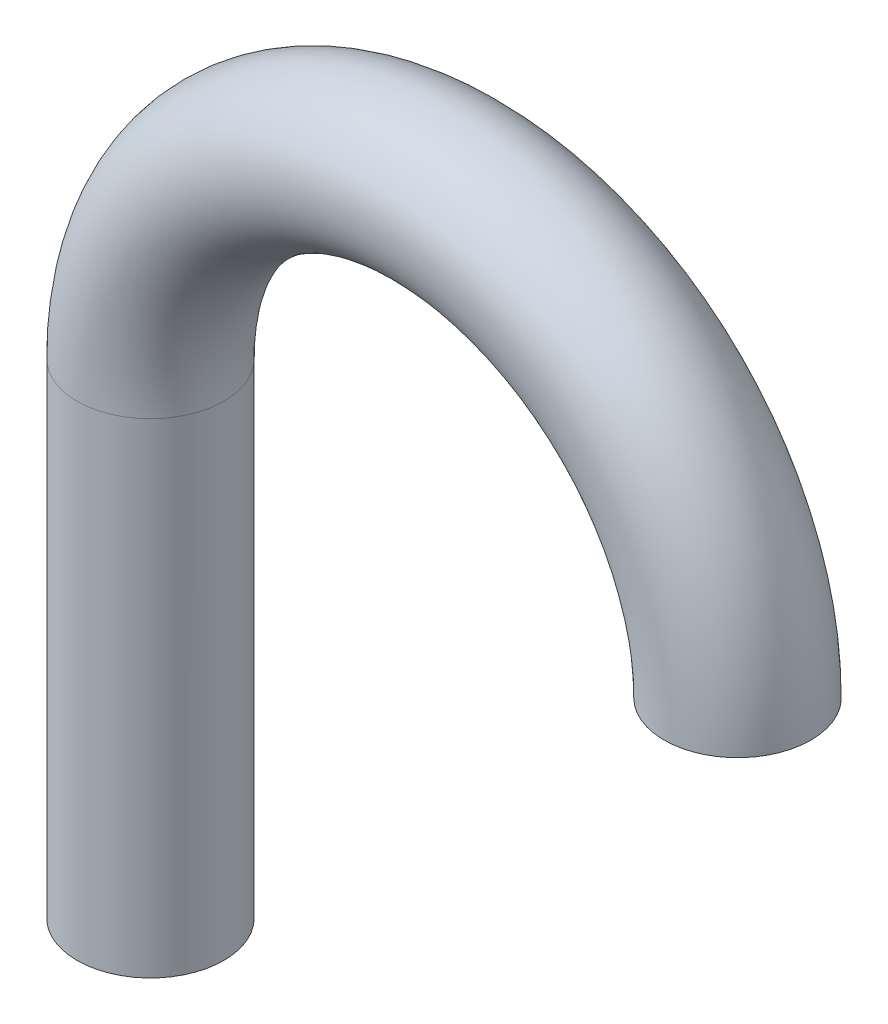
ISO-10303-21;
HEADER;
FILE_DESCRIPTION(('STEP AP214'),'2;1');
FILE_NAME('part.step','',(''),(''),'','','');
FILE_SCHEMA(('AUTOMOTIVE_DESIGN { 1 0 10303 214 1 1 1 1 }'));
ENDSEC;
DATA;
#1=APPLICATION_CONTEXT('core data for automotive mechanical design processes');
#2=APPLICATION_PROTOCOL_DEFINITION('international standard','automotive_design',2000,#1);
#3=PRODUCT_CONTEXT('',#1,'mechanical');
#4=PRODUCT('Part','Part','',(#3));
#5=PRODUCT_RELATED_PRODUCT_CATEGORY('part','',(#4));
#6=PRODUCT_DEFINITION_FORMATION('','',#4);
#7=PRODUCT_DEFINITION_CONTEXT('part definition',#1,'design');
#8=PRODUCT_DEFINITION('design','',#6,#7);
#9=PRODUCT_DEFINITION_SHAPE('','',#8);
#10=(LENGTH_UNIT() NAMED_UNIT(*) SI_UNIT(.MILLI.,.METRE.));
#11=(NAMED_UNIT(*) PLANE_ANGLE_UNIT() SI_UNIT($,.RADIAN.));
#12=(NAMED_UNIT(*) SI_UNIT($,.STERADIAN.) SOLID_ANGLE_UNIT());
#13=UNCERTAINTY_MEASURE_WITH_UNIT(LENGTH_MEASURE(1.E-05),#10,'distance_accuracy_value','');
#14=(GEOMETRIC_REPRESENTATION_CONTEXT(3) GLOBAL_UNCERTAINTY_ASSIGNED_CONTEXT((#13)) GLOBAL_UNIT_ASSIGNED_CONTEXT((#10,
#11,#12)) REPRESENTATION_CONTEXT('',''));
#15=CARTESIAN_POINT('',(0.,0.,0.));
#16=DIRECTION('',(0.,0.,1.));
#17=DIRECTION('',(1.,0.,0.));
#18=AXIS2_PLACEMENT_3D('',#15,#16,#17);
#19=CARTESIAN_POINT('',(-42.75,33.,0.999999999999977));
#20=DIRECTION('',(0.,-1.,0.));
#21=DIRECTION('',(0.,0.,-1.));
#22=AXIS2_PLACEMENT_3D('',#19,#20,#21);
#23=CYLINDRICAL_SURFACE('',#22,1.25);
#24=CARTESIAN_POINT('',(-42.75,32.,0.999999999999977));
#25=DIRECTION('',(0.,1.,0.));
#26=DIRECTION('',(0.,0.,1.));
#27=AXIS2_PLACEMENT_3D('',#24,#25,#26);
#28=CIRCLE('',#27,1.25);
#29=CARTESIAN_POINT('',(-42.75,32.,2.24999999999997));
#30=VERTEX_POINT('',#29);
#31=EDGE_CURVE('E10',#30,#30,#28,.T.);
#32=ORIENTED_EDGE('',*,*,#31,.T.);
#33=EDGE_LOOP('',(#32));
#34=FACE_BOUND('',#33,.T.);
#35=CARTESIAN_POINT('',(-42.75,40.25,0.999999999999977));
#36=DIRECTION('',(0.,1.,0.));
#37=DIRECTION('',(0.,0.,1.));
#38=AXIS2_PLACEMENT_3D('',#35,#36,#37);
#39=CIRCLE('',#38,1.25);
#40=CARTESIAN_POINT('',(-44.,40.25,0.999999999999977));
#41=VERTEX_POINT('',#40);
#42=EDGE_CURVE('E46',#41,#41,#39,.T.);
#43=ORIENTED_EDGE('',*,*,#42,.F.);
#44=EDGE_LOOP('',(#43));
#45=FACE_BOUND('',#44,.T.);
#46=ADVANCED_FACE('F36',(#34,#45),#23,.T.);
#47=CARTESIAN_POINT('',(-42.75,32.,0.999999999999977));
#48=DIRECTION('',(0.,1.,0.));
#49=DIRECTION('',(0.,0.,1.));
#50=AXIS2_PLACEMENT_3D('',#47,#48,#49);
#51=PLANE('',#50);
#52=ORIENTED_EDGE('',*,*,#31,.F.);
#53=EDGE_LOOP('',(#52));
#54=FACE_BOUND('',#53,.T.);
#55=ADVANCED_FACE('F82',(#54),#51,.F.);
#56=CARTESIAN_POINT('',(-32.75,40.25,0.999999999999977));
#57=DIRECTION('',(0.,-1.,0.));
#58=DIRECTION('',(0.,0.,1.));
#59=AXIS2_PLACEMENT_3D('',#56,#57,#58);
#60=PLANE('',#59);
#61=CARTESIAN_POINT('',(-32.75,40.25,0.999999999999977));
#62=DIRECTION('',(0.,-1.,0.));
#63=DIRECTION('',(1.,0.,0.));
#64=AXIS2_PLACEMENT_3D('',#61,#62,#63);
#65=CIRCLE('',#64,0.749999999999997);
#66=CARTESIAN_POINT('',(-32.,40.25,0.999999999999977));
#67=VERTEX_POINT('',#66);
#68=EDGE_CURVE('E53',#67,#67,#65,.T.);
#69=ORIENTED_EDGE('',*,*,#68,.F.);
#70=EDGE_LOOP('',(#69));
#71=FACE_BOUND('',#70,.T.);
#72=CARTESIAN_POINT('',(-32.75,40.25,0.999999999999977));
#73=DIRECTION('',(0.,-1.,0.));
#74=DIRECTION('',(0.,0.,1.));
#75=AXIS2_PLACEMENT_3D('',#72,#73,#74);
#76=CIRCLE('',#75,1.25);
#77=CARTESIAN_POINT('',(-31.5,40.25,0.999999999999977));
#78=VERTEX_POINT('',#77);
#79=EDGE_CURVE('E42',#78,#78,#76,.T.);
#80=ORIENTED_EDGE('',*,*,#79,.T.);
#81=EDGE_LOOP('',(#80));
#82=FACE_BOUND('',#81,.T.);
#83=ADVANCED_FACE('F69',(#71,#82),#60,.T.);
#84=CARTESIAN_POINT('',(-37.75,40.25,0.999999999999977));
#85=DIRECTION('',(0.,0.,-1.));
#86=DIRECTION('',(-1.,0.,0.));
#87=AXIS2_PLACEMENT_3D('',#84,#85,#86);
#88=TOROIDAL_SURFACE('',#87,5.00000000000001,1.25);
#89=CARTESIAN_POINT('',(-37.75,40.25,0.999999999999977));
#90=DIRECTION('',(0.,0.,-1.));
#91=DIRECTION('',(-1.,0.,0.));
#92=AXIS2_PLACEMENT_3D('',#89,#90,#91);
#93=CIRCLE('',#92,6.25000000000001);
#94=EDGE_CURVE('',#41,#78,#93,.T.);
#95=ORIENTED_EDGE('',*,*,#42,.T.);
#96=ORIENTED_EDGE('',*,*,#79,.F.);
#97=ORIENTED_EDGE('',*,*,#94,.T.);
#98=ORIENTED_EDGE('',*,*,#94,.F.);
#99=EDGE_LOOP('',(#95,#97,#96,#98));
#100=FACE_BOUND('',#99,.T.);
#101=ADVANCED_FACE('F67',(#100),#88,.T.);
#102=CARTESIAN_POINT('',(-42.75,33.,0.999999999999977));
#103=DIRECTION('',(0.,-1.,0.));
#104=DIRECTION('',(0.,0.,-1.));
#105=AXIS2_PLACEMENT_3D('',#102,#103,#104);
#106=CYLINDRICAL_SURFACE('',#105,0.749999999999998);
#107=CARTESIAN_POINT('',(-42.75,32.5,0.999999999999977));
#108=DIRECTION('',(0.,1.,0.));
#109=DIRECTION('',(0.,0.,1.));
#110=AXIS2_PLACEMENT_3D('',#107,#108,#109);
#111=CIRCLE('',#110,0.749999999999998);
#112=CARTESIAN_POINT('',(-42.75,32.5,1.74999999999997));
#113=VERTEX_POINT('',#112);
#114=EDGE_CURVE('E50',#113,#113,#111,.T.);
#115=ORIENTED_EDGE('',*,*,#114,.F.);
#116=EDGE_LOOP('',(#115));
#117=FACE_BOUND('',#116,.T.);
#118=CARTESIAN_POINT('',(-42.75,40.25,0.999999999999977));
#119=DIRECTION('',(0.,-1.,0.));
#120=DIRECTION('',(0.,0.,-1.));
#121=AXIS2_PLACEMENT_3D('',#118,#119,#120);
#122=CIRCLE('',#121,0.749999999999997);
#123=CARTESIAN_POINT('',(-43.5,40.25,0.999999999999977));
#124=VERTEX_POINT('',#123);
#125=EDGE_CURVE('E56',#124,#124,#122,.F.);
#126=ORIENTED_EDGE('',*,*,#125,.T.);
#127=EDGE_LOOP('',(#126));
#128=FACE_BOUND('',#127,.T.);
#129=ADVANCED_FACE('F64',(#117,#128),#106,.F.);
#130=CARTESIAN_POINT('',(-42.75,32.5,0.999999999999977));
#131=DIRECTION('',(0.,1.,0.));
#132=DIRECTION('',(0.,0.,1.));
#133=AXIS2_PLACEMENT_3D('',#130,#131,#132);
#134=PLANE('',#133);
#135=ORIENTED_EDGE('',*,*,#114,.T.);
#136=EDGE_LOOP('',(#135));
#137=FACE_BOUND('',#136,.T.);
#138=ADVANCED_FACE('F62',(#137),#134,.T.);
#139=CARTESIAN_POINT('',(-37.75,40.25,0.999999999999977));
#140=DIRECTION('',(0.,0.,-1.));
#141=DIRECTION('',(-1.,0.,0.));
#142=AXIS2_PLACEMENT_3D('',#139,#140,#141);
#143=TOROIDAL_SURFACE('',#142,5.00000000000001,0.749999999999997);
#144=CARTESIAN_POINT('',(-37.75,40.25,0.999999999999977));
#145=DIRECTION('',(0.,0.,-1.));
#146=DIRECTION('',(-1.,0.,0.));
#147=AXIS2_PLACEMENT_3D('',#144,#145,#146);
#148=CIRCLE('',#147,5.75000000000001);
#149=EDGE_CURVE('',#124,#67,#148,.T.);
#150=ORIENTED_EDGE('',*,*,#125,.F.);
#151=ORIENTED_EDGE('',*,*,#68,.T.);
#152=ORIENTED_EDGE('',*,*,#149,.T.);
#153=ORIENTED_EDGE('',*,*,#149,.F.);
#154=EDGE_LOOP('',(#150,#152,#151,#153));
#155=FACE_BOUND('',#154,.T.);
#156=ADVANCED_FACE('F72',(#155),#143,.F.);
#157=CLOSED_SHELL('',(#46,#55,#83,#101,#129,#138,#156));
#158=MANIFOLD_SOLID_BREP('B2',#157);
#159=ADVANCED_BREP_SHAPE_REPRESENTATION('',(#18,#158),#14);
#160=SHAPE_DEFINITION_REPRESENTATION(#9,#159);
ENDSEC;
END-ISO-10303-21;
